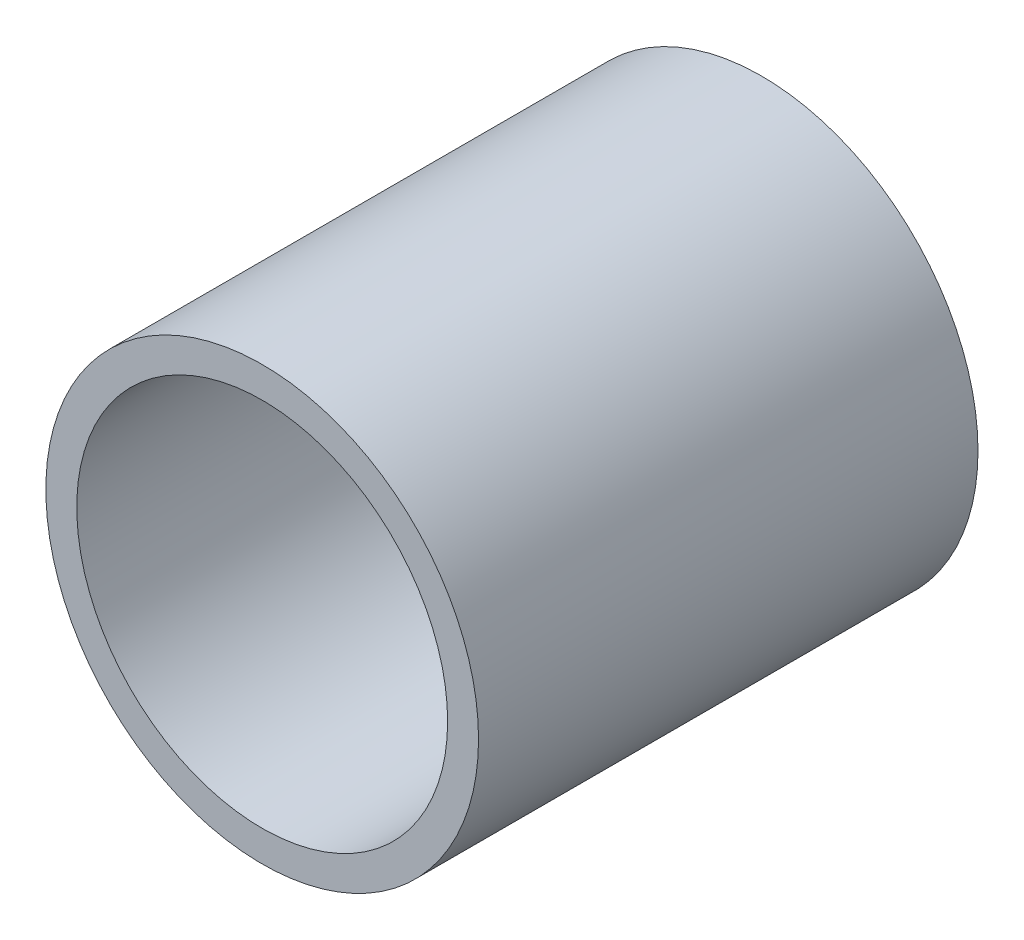
ISO-10303-21;
HEADER;
FILE_DESCRIPTION(('STEP AP214'),'2;1');
FILE_NAME('part.step','',(''),(''),'','','');
FILE_SCHEMA(('AUTOMOTIVE_DESIGN { 1 0 10303 214 1 1 1 1 }'));
ENDSEC;
DATA;
#1=APPLICATION_CONTEXT('core data for automotive mechanical design processes');
#2=APPLICATION_PROTOCOL_DEFINITION('international standard','automotive_design',2000,#1);
#3=PRODUCT_CONTEXT('',#1,'mechanical');
#4=PRODUCT('Part','Part','',(#3));
#5=PRODUCT_RELATED_PRODUCT_CATEGORY('part','',(#4));
#6=PRODUCT_DEFINITION_FORMATION('','',#4);
#7=PRODUCT_DEFINITION_CONTEXT('part definition',#1,'design');
#8=PRODUCT_DEFINITION('design','',#6,#7);
#9=PRODUCT_DEFINITION_SHAPE('','',#8);
#10=(LENGTH_UNIT() NAMED_UNIT(*) SI_UNIT(.MILLI.,.METRE.));
#11=(NAMED_UNIT(*) PLANE_ANGLE_UNIT() SI_UNIT($,.RADIAN.));
#12=(NAMED_UNIT(*) SI_UNIT($,.STERADIAN.) SOLID_ANGLE_UNIT());
#13=UNCERTAINTY_MEASURE_WITH_UNIT(LENGTH_MEASURE(1.E-05),#10,'distance_accuracy_value','');
#14=(GEOMETRIC_REPRESENTATION_CONTEXT(3) GLOBAL_UNCERTAINTY_ASSIGNED_CONTEXT((#13)) GLOBAL_UNIT_ASSIGNED_CONTEXT((#10,
#11,#12)) REPRESENTATION_CONTEXT('',''));
#15=CARTESIAN_POINT('',(0.,0.,0.));
#16=DIRECTION('',(0.,0.,1.));
#17=DIRECTION('',(1.,0.,0.));
#18=AXIS2_PLACEMENT_3D('',#15,#16,#17);
#19=CARTESIAN_POINT('',(0.,0.,0.));
#20=DIRECTION('',(0.,0.,1.));
#21=DIRECTION('',(1.,0.,0.));
#22=AXIS2_PLACEMENT_3D('',#19,#20,#21);
#23=CYLINDRICAL_SURFACE('',#22,9.525);
#24=CARTESIAN_POINT('',(0.,0.,0.));
#25=DIRECTION('',(0.,0.,1.));
#26=DIRECTION('',(1.,0.,0.));
#27=AXIS2_PLACEMENT_3D('',#24,#25,#26);
#28=CIRCLE('',#27,9.525);
#29=CARTESIAN_POINT('',(9.525,0.,0.));
#30=VERTEX_POINT('',#29);
#31=EDGE_CURVE('E27',#30,#30,#28,.F.);
#32=ORIENTED_EDGE('',*,*,#31,.T.);
#33=EDGE_LOOP('',(#32));
#34=FACE_BOUND('',#33,.T.);
#35=CARTESIAN_POINT('',(0.,0.,25.654));
#36=DIRECTION('',(0.,0.,1.));
#37=DIRECTION('',(1.,0.,0.));
#38=AXIS2_PLACEMENT_3D('',#35,#36,#37);
#39=CIRCLE('',#38,9.525);
#40=CARTESIAN_POINT('',(9.525,0.,25.654));
#41=VERTEX_POINT('',#40);
#42=EDGE_CURVE('E18',#41,#41,#39,.F.);
#43=ORIENTED_EDGE('',*,*,#42,.F.);
#44=EDGE_LOOP('',(#43));
#45=FACE_BOUND('',#44,.T.);
#46=ADVANCED_FACE('F15',(#34,#45),#23,.F.);
#47=CARTESIAN_POINT('',(0.,0.,25.654));
#48=DIRECTION('',(0.,0.,1.));
#49=DIRECTION('',(1.,0.,0.));
#50=AXIS2_PLACEMENT_3D('',#47,#48,#49);
#51=PLANE('',#50);
#52=CARTESIAN_POINT('',(0.,0.,25.654));
#53=DIRECTION('',(0.,0.,1.));
#54=DIRECTION('',(1.,0.,0.));
#55=AXIS2_PLACEMENT_3D('',#52,#53,#54);
#56=CIRCLE('',#55,11.1125);
#57=CARTESIAN_POINT('',(11.1125,0.,25.654));
#58=VERTEX_POINT('',#57);
#59=EDGE_CURVE('E22',#58,#58,#56,.F.);
#60=ORIENTED_EDGE('',*,*,#59,.F.);
#61=EDGE_LOOP('',(#60));
#62=FACE_BOUND('',#61,.T.);
#63=ORIENTED_EDGE('',*,*,#42,.T.);
#64=EDGE_LOOP('',(#63));
#65=FACE_BOUND('',#64,.T.);
#66=ADVANCED_FACE('F35',(#62,#65),#51,.T.);
#67=CARTESIAN_POINT('',(0.,0.,0.));
#68=DIRECTION('',(0.,0.,1.));
#69=DIRECTION('',(1.,0.,0.));
#70=AXIS2_PLACEMENT_3D('',#67,#68,#69);
#71=PLANE('',#70);
#72=CARTESIAN_POINT('',(0.,0.,0.));
#73=DIRECTION('',(0.,0.,1.));
#74=DIRECTION('',(1.,0.,0.));
#75=AXIS2_PLACEMENT_3D('',#72,#73,#74);
#76=CIRCLE('',#75,11.1125);
#77=CARTESIAN_POINT('',(11.1125,0.,0.));
#78=VERTEX_POINT('',#77);
#79=EDGE_CURVE('E10',#78,#78,#76,.T.);
#80=ORIENTED_EDGE('',*,*,#79,.F.);
#81=EDGE_LOOP('',(#80));
#82=FACE_BOUND('',#81,.T.);
#83=ORIENTED_EDGE('',*,*,#31,.F.);
#84=EDGE_LOOP('',(#83));
#85=FACE_BOUND('',#84,.T.);
#86=ADVANCED_FACE('F42',(#82,#85),#71,.F.);
#87=CARTESIAN_POINT('',(0.,0.,0.));
#88=DIRECTION('',(0.,0.,1.));
#89=DIRECTION('',(1.,0.,0.));
#90=AXIS2_PLACEMENT_3D('',#87,#88,#89);
#91=CYLINDRICAL_SURFACE('',#90,11.1125);
#92=ORIENTED_EDGE('',*,*,#79,.T.);
#93=EDGE_LOOP('',(#92));
#94=FACE_BOUND('',#93,.T.);
#95=ORIENTED_EDGE('',*,*,#59,.T.);
#96=EDGE_LOOP('',(#95));
#97=FACE_BOUND('',#96,.T.);
#98=ADVANCED_FACE('F44',(#94,#97),#91,.T.);
#99=CLOSED_SHELL('',(#46,#66,#86,#98));
#100=MANIFOLD_SOLID_BREP('B1',#99);
#101=ADVANCED_BREP_SHAPE_REPRESENTATION('',(#18,#100),#14);
#102=SHAPE_DEFINITION_REPRESENTATION(#9,#101);
ENDSEC;
END-ISO-10303-21;
